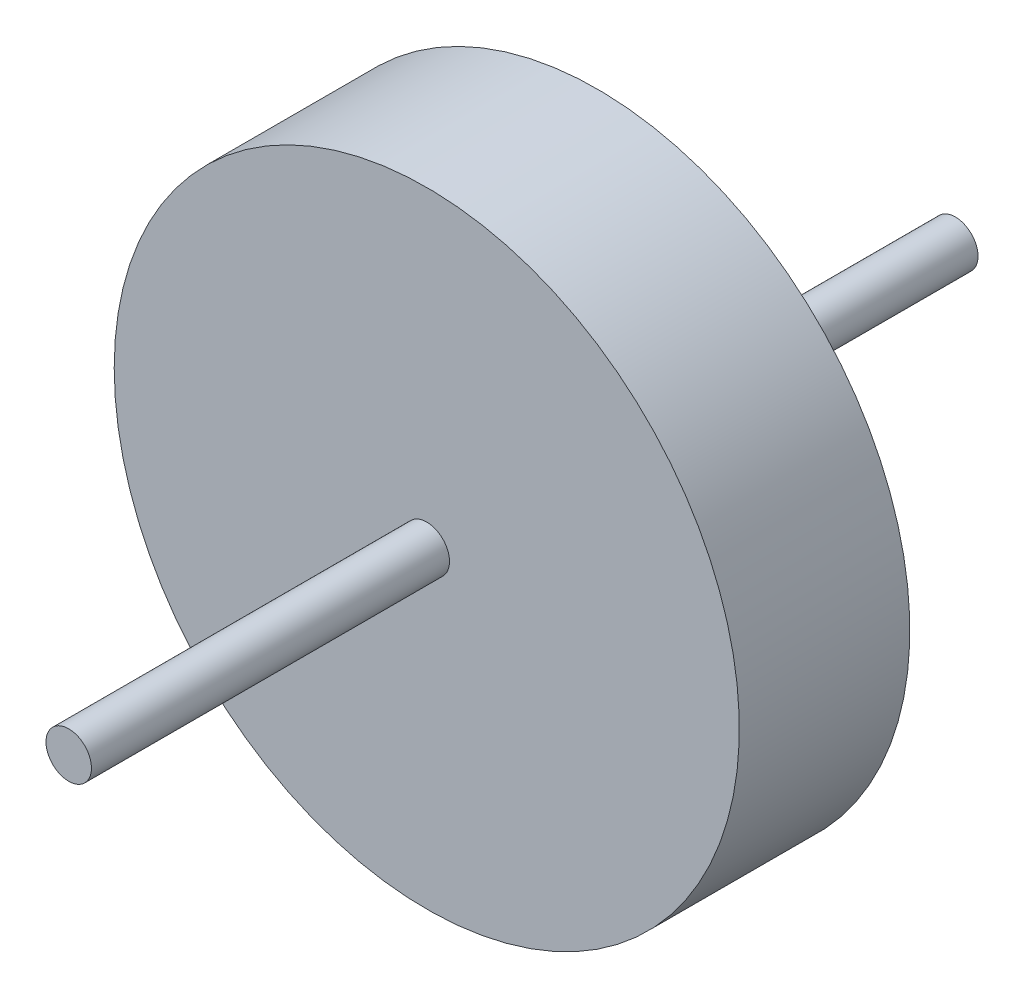
ISO-10303-21;
HEADER;
FILE_DESCRIPTION(('STEP AP214'),'2;1');
FILE_NAME('part.step','',(''),(''),'','','');
FILE_SCHEMA(('AUTOMOTIVE_DESIGN { 1 0 10303 214 1 1 1 1 }'));
ENDSEC;
DATA;
#1=APPLICATION_CONTEXT('core data for automotive mechanical design processes');
#2=APPLICATION_PROTOCOL_DEFINITION('international standard','automotive_design',2000,#1);
#3=PRODUCT_CONTEXT('',#1,'mechanical');
#4=PRODUCT('Part','Part','',(#3));
#5=PRODUCT_RELATED_PRODUCT_CATEGORY('part','',(#4));
#6=PRODUCT_DEFINITION_FORMATION('','',#4);
#7=PRODUCT_DEFINITION_CONTEXT('part definition',#1,'design');
#8=PRODUCT_DEFINITION('design','',#6,#7);
#9=PRODUCT_DEFINITION_SHAPE('','',#8);
#10=(LENGTH_UNIT() NAMED_UNIT(*) SI_UNIT(.MILLI.,.METRE.));
#11=(NAMED_UNIT(*) PLANE_ANGLE_UNIT() SI_UNIT($,.RADIAN.));
#12=(NAMED_UNIT(*) SI_UNIT($,.STERADIAN.) SOLID_ANGLE_UNIT());
#13=UNCERTAINTY_MEASURE_WITH_UNIT(LENGTH_MEASURE(1.E-05),#10,'distance_accuracy_value','');
#14=(GEOMETRIC_REPRESENTATION_CONTEXT(3) GLOBAL_UNCERTAINTY_ASSIGNED_CONTEXT((#13)) GLOBAL_UNIT_ASSIGNED_CONTEXT((#10,
#11,#12)) REPRESENTATION_CONTEXT('',''));
#15=CARTESIAN_POINT('',(0.,0.,0.));
#16=DIRECTION('',(0.,0.,1.));
#17=DIRECTION('',(1.,0.,0.));
#18=AXIS2_PLACEMENT_3D('',#15,#16,#17);
#19=CARTESIAN_POINT('',(0.,0.,0.));
#20=DIRECTION('',(0.,0.,-1.));
#21=DIRECTION('',(1.,0.,0.));
#22=AXIS2_PLACEMENT_3D('',#19,#20,#21);
#23=CYLINDRICAL_SURFACE('',#22,2.);
#24=CARTESIAN_POINT('',(0.,0.,-31.5));
#25=DIRECTION('',(0.,0.,-1.));
#26=DIRECTION('',(1.,0.,0.));
#27=AXIS2_PLACEMENT_3D('',#24,#25,#26);
#28=CIRCLE('',#27,2.);
#29=CARTESIAN_POINT('',(-2.,0.,-31.5));
#30=VERTEX_POINT('',#29);
#31=EDGE_CURVE('E53',#30,#30,#28,.T.);
#32=ORIENTED_EDGE('',*,*,#31,.F.);
#33=DIRECTION('',(0.,0.,1.));
#34=VECTOR('',#33,1.);
#35=CARTESIAN_POINT('',(-2.,0.,0.));
#36=LINE('',#35,#34);
#37=CARTESIAN_POINT('',(-2.,0.,0.));
#38=VERTEX_POINT('',#37);
#39=EDGE_CURVE('E11',#30,#38,#36,.T.);
#40=ORIENTED_EDGE('',*,*,#39,.T.);
#41=CARTESIAN_POINT('',(0.,0.,0.));
#42=DIRECTION('',(0.,0.,1.));
#43=DIRECTION('',(1.,0.,0.));
#44=AXIS2_PLACEMENT_3D('',#41,#42,#43);
#45=CIRCLE('',#44,2.);
#46=EDGE_CURVE('E114',#38,#38,#45,.T.);
#47=ORIENTED_EDGE('',*,*,#46,.F.);
#48=ORIENTED_EDGE('',*,*,#39,.F.);
#49=EDGE_LOOP('',(#32,#40,#47,#48));
#50=FACE_BOUND('',#49,.T.);
#51=ADVANCED_FACE('F43',(#50),#23,.T.);
#52=CARTESIAN_POINT('',(0.,0.,-31.5));
#53=DIRECTION('',(0.,0.,1.));
#54=DIRECTION('',(1.,0.,0.));
#55=AXIS2_PLACEMENT_3D('',#52,#53,#54);
#56=PLANE('',#55);
#57=ORIENTED_EDGE('',*,*,#31,.T.);
#58=EDGE_LOOP('',(#57));
#59=FACE_BOUND('',#58,.T.);
#60=ADVANCED_FACE('F141',(#59),#56,.F.);
#61=CARTESIAN_POINT('',(0.,0.,0.));
#62=DIRECTION('',(0.,0.,1.));
#63=DIRECTION('',(1.,0.,0.));
#64=AXIS2_PLACEMENT_3D('',#61,#62,#63);
#65=CYLINDRICAL_SURFACE('',#64,2.);
#66=CARTESIAN_POINT('',(0.,0.,46.5));
#67=DIRECTION('',(0.,0.,1.));
#68=DIRECTION('',(1.,0.,0.));
#69=AXIS2_PLACEMENT_3D('',#66,#67,#68);
#70=CIRCLE('',#69,2.);
#71=CARTESIAN_POINT('',(-2.,0.,46.5));
#72=VERTEX_POINT('',#71);
#73=EDGE_CURVE('E89',#72,#72,#70,.T.);
#74=ORIENTED_EDGE('',*,*,#73,.F.);
#75=DIRECTION('',(0.,0.,-1.));
#76=VECTOR('',#75,1.);
#77=CARTESIAN_POINT('',(-2.,0.,0.));
#78=LINE('',#77,#76);
#79=CARTESIAN_POINT('',(-2.,0.,15.));
#80=VERTEX_POINT('',#79);
#81=EDGE_CURVE('E91',#72,#80,#78,.T.);
#82=ORIENTED_EDGE('',*,*,#81,.T.);
#83=CARTESIAN_POINT('',(0.,0.,15.));
#84=DIRECTION('',(0.,0.,-1.));
#85=DIRECTION('',(1.,0.,0.));
#86=AXIS2_PLACEMENT_3D('',#83,#84,#85);
#87=CIRCLE('',#86,2.);
#88=EDGE_CURVE('E84',#80,#80,#87,.T.);
#89=ORIENTED_EDGE('',*,*,#88,.F.);
#90=ORIENTED_EDGE('',*,*,#81,.F.);
#91=EDGE_LOOP('',(#74,#82,#89,#90));
#92=FACE_BOUND('',#91,.T.);
#93=ADVANCED_FACE('F90',(#92),#65,.T.);
#94=CARTESIAN_POINT('',(0.,0.,46.5));
#95=DIRECTION('',(0.,0.,1.));
#96=DIRECTION('',(1.,0.,0.));
#97=AXIS2_PLACEMENT_3D('',#94,#95,#96);
#98=PLANE('',#97);
#99=ORIENTED_EDGE('',*,*,#73,.T.);
#100=EDGE_LOOP('',(#99));
#101=FACE_BOUND('',#100,.T.);
#102=ADVANCED_FACE('F150',(#101),#98,.T.);
#103=CARTESIAN_POINT('',(0.,0.,0.));
#104=DIRECTION('',(0.,0.,1.));
#105=DIRECTION('',(1.,0.,0.));
#106=AXIS2_PLACEMENT_3D('',#103,#104,#105);
#107=CYLINDRICAL_SURFACE('',#106,27.5);
#108=CARTESIAN_POINT('',(0.,0.,15.));
#109=DIRECTION('',(0.,0.,1.));
#110=DIRECTION('',(1.,0.,0.));
#111=AXIS2_PLACEMENT_3D('',#108,#109,#110);
#112=CIRCLE('',#111,27.5);
#113=CARTESIAN_POINT('',(-27.5,0.,15.));
#114=VERTEX_POINT('',#113);
#115=EDGE_CURVE('E108',#114,#114,#112,.T.);
#116=ORIENTED_EDGE('',*,*,#115,.F.);
#117=DIRECTION('',(0.,0.,-1.));
#118=VECTOR('',#117,1.);
#119=CARTESIAN_POINT('',(-27.5,0.,0.));
#120=LINE('',#119,#118);
#121=CARTESIAN_POINT('',(-27.5,0.,0.));
#122=VERTEX_POINT('',#121);
#123=EDGE_CURVE('E94',#114,#122,#120,.T.);
#124=ORIENTED_EDGE('',*,*,#123,.T.);
#125=CARTESIAN_POINT('',(0.,0.,0.));
#126=DIRECTION('',(0.,0.,1.));
#127=DIRECTION('',(1.,0.,0.));
#128=AXIS2_PLACEMENT_3D('',#125,#126,#127);
#129=CIRCLE('',#128,27.5);
#130=EDGE_CURVE('E101',#122,#122,#129,.T.);
#131=ORIENTED_EDGE('',*,*,#130,.T.);
#132=ORIENTED_EDGE('',*,*,#123,.F.);
#133=EDGE_LOOP('',(#116,#124,#131,#132));
#134=FACE_BOUND('',#133,.T.);
#135=ADVANCED_FACE('F156',(#134),#107,.T.);
#136=CARTESIAN_POINT('',(0.,0.,15.));
#137=DIRECTION('',(0.,0.,1.));
#138=DIRECTION('',(1.,0.,0.));
#139=AXIS2_PLACEMENT_3D('',#136,#137,#138);
#140=PLANE('',#139);
#141=ORIENTED_EDGE('',*,*,#115,.T.);
#142=EDGE_LOOP('',(#141));
#143=FACE_BOUND('',#142,.T.);
#144=ORIENTED_EDGE('',*,*,#88,.T.);
#145=EDGE_LOOP('',(#144));
#146=FACE_BOUND('',#145,.T.);
#147=ADVANCED_FACE('F153',(#143,#146),#140,.T.);
#148=CARTESIAN_POINT('',(0.,0.,0.));
#149=DIRECTION('',(0.,0.,1.));
#150=DIRECTION('',(1.,0.,0.));
#151=AXIS2_PLACEMENT_3D('',#148,#149,#150);
#152=PLANE('',#151);
#153=CARTESIAN_POINT('',(-21.6167627549439,6.08213575721534,0.));
#154=DIRECTION('',(0.,0.,1.));
#155=DIRECTION('',(1.,0.,0.));
#156=AXIS2_PLACEMENT_3D('',#153,#154,#155);
#157=CIRCLE('',#156,2.47206759609404);
#158=CARTESIAN_POINT('',(-19.1446951588499,6.08213575721534,0.));
#159=VERTEX_POINT('',#158);
#160=EDGE_CURVE('E46',#159,#159,#157,.T.);
#161=ORIENTED_EDGE('',*,*,#160,.T.);
#162=EDGE_LOOP('',(#161));
#163=FACE_BOUND('',#162,.T.);
#164=ORIENTED_EDGE('',*,*,#130,.F.);
#165=EDGE_LOOP('',(#164));
#166=FACE_BOUND('',#165,.T.);
#167=ORIENTED_EDGE('',*,*,#46,.T.);
#168=EDGE_LOOP('',(#167));
#169=FACE_BOUND('',#168,.T.);
#170=ADVANCED_FACE('F138',(#163,#166,#169),#152,.F.);
#171=CARTESIAN_POINT('',(-21.6167627549439,6.08213575721534,-10.));
#172=DIRECTION('',(0.,0.,1.));
#173=DIRECTION('',(1.,0.,0.));
#174=AXIS2_PLACEMENT_3D('',#171,#172,#173);
#175=CYLINDRICAL_SURFACE('',#174,2.47206759609404);
#176=CARTESIAN_POINT('',(-21.6167627549439,6.08213575721534,-10.));
#177=DIRECTION('',(0.,0.,1.));
#178=DIRECTION('',(1.,0.,0.));
#179=AXIS2_PLACEMENT_3D('',#176,#177,#178);
#180=CIRCLE('',#179,2.47206759609404);
#181=CARTESIAN_POINT('',(-19.1446951588499,6.08213575721534,-10.));
#182=VERTEX_POINT('',#181);
#183=EDGE_CURVE('E122',#182,#182,#180,.T.);
#184=ORIENTED_EDGE('',*,*,#183,.T.);
#185=EDGE_LOOP('',(#184));
#186=FACE_BOUND('',#185,.T.);
#187=ORIENTED_EDGE('',*,*,#160,.F.);
#188=EDGE_LOOP('',(#187));
#189=FACE_BOUND('',#188,.T.);
#190=ADVANCED_FACE('F129',(#186,#189),#175,.T.);
#191=CARTESIAN_POINT('',(-21.6167627549439,6.08213575721534,-10.));
#192=DIRECTION('',(0.,0.,1.));
#193=DIRECTION('',(1.,0.,0.));
#194=AXIS2_PLACEMENT_3D('',#191,#192,#193);
#195=PLANE('',#194);
#196=ORIENTED_EDGE('',*,*,#183,.F.);
#197=EDGE_LOOP('',(#196));
#198=FACE_BOUND('',#197,.T.);
#199=ADVANCED_FACE('F132',(#198),#195,.F.);
#200=CLOSED_SHELL('',(#51,#60,#93,#102,#135,#147,#170,#190,#199));
#201=MANIFOLD_SOLID_BREP('B2',#200);
#202=ADVANCED_BREP_SHAPE_REPRESENTATION('',(#18,#201),#14);
#203=SHAPE_DEFINITION_REPRESENTATION(#9,#202);
ENDSEC;
END-ISO-10303-21;
